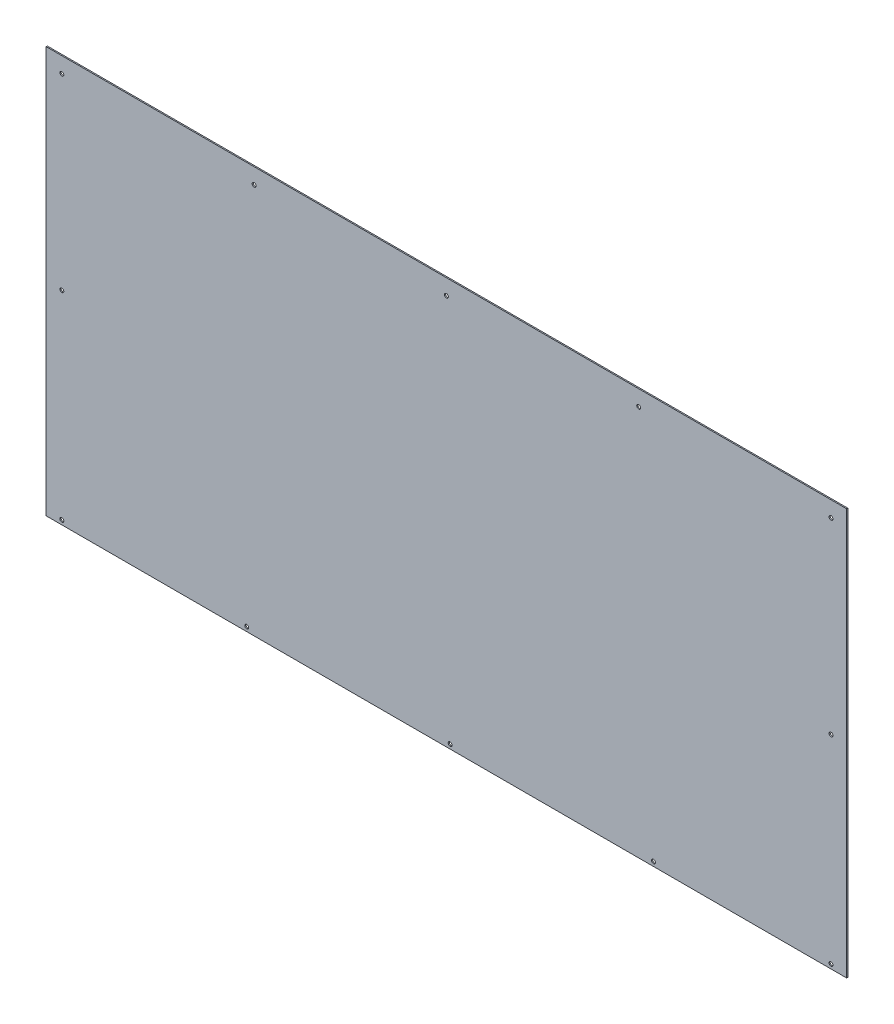
ISO-10303-21;
HEADER;
FILE_DESCRIPTION(('STEP AP214'),'2;1');
FILE_NAME('part.step','',(''),(''),'','','');
FILE_SCHEMA(('AUTOMOTIVE_DESIGN { 1 0 10303 214 1 1 1 1 }'));
ENDSEC;
DATA;
#1=APPLICATION_CONTEXT('core data for automotive mechanical design processes');
#2=APPLICATION_PROTOCOL_DEFINITION('international standard','automotive_design',2000,#1);
#3=PRODUCT_CONTEXT('',#1,'mechanical');
#4=PRODUCT('Part','Part','',(#3));
#5=PRODUCT_RELATED_PRODUCT_CATEGORY('part','',(#4));
#6=PRODUCT_DEFINITION_FORMATION('','',#4);
#7=PRODUCT_DEFINITION_CONTEXT('part definition',#1,'design');
#8=PRODUCT_DEFINITION('design','',#6,#7);
#9=PRODUCT_DEFINITION_SHAPE('','',#8);
#10=(LENGTH_UNIT() NAMED_UNIT(*) SI_UNIT(.MILLI.,.METRE.));
#11=(NAMED_UNIT(*) PLANE_ANGLE_UNIT() SI_UNIT($,.RADIAN.));
#12=(NAMED_UNIT(*) SI_UNIT($,.STERADIAN.) SOLID_ANGLE_UNIT());
#13=UNCERTAINTY_MEASURE_WITH_UNIT(LENGTH_MEASURE(1.E-05),#10,'distance_accuracy_value','');
#14=(GEOMETRIC_REPRESENTATION_CONTEXT(3) GLOBAL_UNCERTAINTY_ASSIGNED_CONTEXT((#13)) GLOBAL_UNIT_ASSIGNED_CONTEXT((#10,
#11,#12)) REPRESENTATION_CONTEXT('',''));
#15=CARTESIAN_POINT('',(0.,0.,0.));
#16=DIRECTION('',(0.,0.,1.));
#17=DIRECTION('',(1.,0.,0.));
#18=AXIS2_PLACEMENT_3D('',#15,#16,#17);
#19=CARTESIAN_POINT('',(650.,330.,1.9));
#20=DIRECTION('',(-1.,0.,0.));
#21=DIRECTION('',(0.,-1.,0.));
#22=AXIS2_PLACEMENT_3D('',#19,#20,#21);
#23=PLANE('',#22);
#24=DIRECTION('',(0.,1.,0.));
#25=VECTOR('',#24,1.);
#26=CARTESIAN_POINT('',(650.,330.,0.));
#27=LINE('',#26,#25);
#28=CARTESIAN_POINT('',(650.,-330.,0.));
#29=VERTEX_POINT('',#28);
#30=CARTESIAN_POINT('',(650.,330.,0.));
#31=VERTEX_POINT('',#30);
#32=EDGE_CURVE('E103',#29,#31,#27,.T.);
#33=ORIENTED_EDGE('',*,*,#32,.T.);
#34=DIRECTION('',(0.,0.,-1.));
#35=VECTOR('',#34,1.);
#36=CARTESIAN_POINT('',(650.,330.,1.9));
#37=LINE('',#36,#35);
#38=CARTESIAN_POINT('',(650.,330.,1.9));
#39=VERTEX_POINT('',#38);
#40=EDGE_CURVE('E11',#39,#31,#37,.T.);
#41=ORIENTED_EDGE('',*,*,#40,.F.);
#42=DIRECTION('',(0.,1.,0.));
#43=VECTOR('',#42,1.);
#44=CARTESIAN_POINT('',(650.,330.,1.9));
#45=LINE('',#44,#43);
#46=CARTESIAN_POINT('',(650.,-330.,1.9));
#47=VERTEX_POINT('',#46);
#48=EDGE_CURVE('E90',#47,#39,#45,.T.);
#49=ORIENTED_EDGE('',*,*,#48,.F.);
#50=DIRECTION('',(0.,0.,-1.));
#51=VECTOR('',#50,1.);
#52=CARTESIAN_POINT('',(650.,-330.,1.9));
#53=LINE('',#52,#51);
#54=EDGE_CURVE('E99',#47,#29,#53,.T.);
#55=ORIENTED_EDGE('',*,*,#54,.T.);
#56=EDGE_LOOP('',(#33,#41,#49,#55));
#57=FACE_BOUND('',#56,.T.);
#58=ADVANCED_FACE('F37',(#57),#23,.F.);
#59=CARTESIAN_POINT('',(-650.,330.,1.9));
#60=DIRECTION('',(0.,-1.,0.));
#61=DIRECTION('',(0.,0.,-1.));
#62=AXIS2_PLACEMENT_3D('',#59,#60,#61);
#63=PLANE('',#62);
#64=DIRECTION('',(-1.,0.,0.));
#65=VECTOR('',#64,1.);
#66=CARTESIAN_POINT('',(-650.,330.,0.));
#67=LINE('',#66,#65);
#68=CARTESIAN_POINT('',(-650.,330.,0.));
#69=VERTEX_POINT('',#68);
#70=EDGE_CURVE('E94',#31,#69,#67,.T.);
#71=ORIENTED_EDGE('',*,*,#70,.T.);
#72=DIRECTION('',(0.,0.,-1.));
#73=VECTOR('',#72,1.);
#74=CARTESIAN_POINT('',(-650.,330.,1.9));
#75=LINE('',#74,#73);
#76=CARTESIAN_POINT('',(-650.,330.,1.9));
#77=VERTEX_POINT('',#76);
#78=EDGE_CURVE('E46',#77,#69,#75,.T.);
#79=ORIENTED_EDGE('',*,*,#78,.F.);
#80=DIRECTION('',(-1.,0.,0.));
#81=VECTOR('',#80,1.);
#82=CARTESIAN_POINT('',(-650.,330.,1.9));
#83=LINE('',#82,#81);
#84=EDGE_CURVE('E85',#39,#77,#83,.T.);
#85=ORIENTED_EDGE('',*,*,#84,.F.);
#86=ORIENTED_EDGE('',*,*,#40,.T.);
#87=EDGE_LOOP('',(#71,#79,#85,#86));
#88=FACE_BOUND('',#87,.T.);
#89=ADVANCED_FACE('F93',(#88),#63,.F.);
#90=CARTESIAN_POINT('',(-650.,330.,1.9));
#91=DIRECTION('',(1.,0.,0.));
#92=DIRECTION('',(0.,1.,0.));
#93=AXIS2_PLACEMENT_3D('',#90,#91,#92);
#94=PLANE('',#93);
#95=DIRECTION('',(0.,-1.,0.));
#96=VECTOR('',#95,1.);
#97=CARTESIAN_POINT('',(-650.,330.,0.));
#98=LINE('',#97,#96);
#99=CARTESIAN_POINT('',(-650.,-330.,0.));
#100=VERTEX_POINT('',#99);
#101=EDGE_CURVE('E72',#69,#100,#98,.T.);
#102=ORIENTED_EDGE('',*,*,#101,.T.);
#103=DIRECTION('',(0.,0.,-1.));
#104=VECTOR('',#103,1.);
#105=CARTESIAN_POINT('',(-650.,-330.,1.9));
#106=LINE('',#105,#104);
#107=CARTESIAN_POINT('',(-650.,-330.,1.9));
#108=VERTEX_POINT('',#107);
#109=EDGE_CURVE('E95',#108,#100,#106,.T.);
#110=ORIENTED_EDGE('',*,*,#109,.F.);
#111=DIRECTION('',(0.,-1.,0.));
#112=VECTOR('',#111,1.);
#113=CARTESIAN_POINT('',(-650.,330.,1.9));
#114=LINE('',#113,#112);
#115=EDGE_CURVE('E88',#77,#108,#114,.T.);
#116=ORIENTED_EDGE('',*,*,#115,.F.);
#117=ORIENTED_EDGE('',*,*,#78,.T.);
#118=EDGE_LOOP('',(#102,#110,#116,#117));
#119=FACE_BOUND('',#118,.T.);
#120=ADVANCED_FACE('F97',(#119),#94,.F.);
#121=CARTESIAN_POINT('',(-650.,-330.,1.9));
#122=DIRECTION('',(0.,1.,0.));
#123=DIRECTION('',(0.,0.,1.));
#124=AXIS2_PLACEMENT_3D('',#121,#122,#123);
#125=PLANE('',#124);
#126=DIRECTION('',(1.,0.,0.));
#127=VECTOR('',#126,1.);
#128=CARTESIAN_POINT('',(-650.,-330.,0.));
#129=LINE('',#128,#127);
#130=EDGE_CURVE('E78',#100,#29,#129,.T.);
#131=ORIENTED_EDGE('',*,*,#130,.T.);
#132=ORIENTED_EDGE('',*,*,#54,.F.);
#133=DIRECTION('',(1.,0.,0.));
#134=VECTOR('',#133,1.);
#135=CARTESIAN_POINT('',(-650.,-330.,1.9));
#136=LINE('',#135,#134);
#137=EDGE_CURVE('E55',#108,#47,#136,.T.);
#138=ORIENTED_EDGE('',*,*,#137,.F.);
#139=ORIENTED_EDGE('',*,*,#109,.T.);
#140=EDGE_LOOP('',(#131,#132,#138,#139));
#141=FACE_BOUND('',#140,.T.);
#142=ADVANCED_FACE('F214',(#141),#125,.F.);
#143=CARTESIAN_POINT('',(0.,0.,1.9));
#144=DIRECTION('',(0.,0.,1.));
#145=DIRECTION('',(1.,0.,0.));
#146=AXIS2_PLACEMENT_3D('',#143,#144,#145);
#147=PLANE('',#146);
#148=CARTESIAN_POINT('',(6.00000000000012,-323.,1.9));
#149=DIRECTION('',(0.,0.,1.));
#150=DIRECTION('',(1.,0.,0.));
#151=AXIS2_PLACEMENT_3D('',#148,#149,#150);
#152=CIRCLE('',#151,3.175);
#153=CARTESIAN_POINT('',(9.17500000000012,-323.,1.9));
#154=VERTEX_POINT('',#153);
#155=EDGE_CURVE('E174',#154,#154,#152,.T.);
#156=ORIENTED_EDGE('',*,*,#155,.F.);
#157=EDGE_LOOP('',(#156));
#158=FACE_BOUND('',#157,.T.);
#159=CARTESIAN_POINT('',(336.3,-323.,1.9));
#160=DIRECTION('',(0.,0.,1.));
#161=DIRECTION('',(1.,0.,0.));
#162=AXIS2_PLACEMENT_3D('',#159,#160,#161);
#163=CIRCLE('',#162,3.17499999999997);
#164=CARTESIAN_POINT('',(339.475,-323.,1.9));
#165=VERTEX_POINT('',#164);
#166=EDGE_CURVE('E177',#165,#165,#163,.T.);
#167=ORIENTED_EDGE('',*,*,#166,.F.);
#168=EDGE_LOOP('',(#167));
#169=FACE_BOUND('',#168,.T.);
#170=CARTESIAN_POINT('',(-324.3,-323.,1.9));
#171=DIRECTION('',(0.,0.,1.));
#172=DIRECTION('',(1.,0.,0.));
#173=AXIS2_PLACEMENT_3D('',#170,#171,#172);
#174=CIRCLE('',#173,3.17499999999997);
#175=CARTESIAN_POINT('',(-321.125,-323.,1.9));
#176=VERTEX_POINT('',#175);
#177=EDGE_CURVE('E149',#176,#176,#174,.T.);
#178=ORIENTED_EDGE('',*,*,#177,.F.);
#179=EDGE_LOOP('',(#178));
#180=FACE_BOUND('',#179,.T.);
#181=CARTESIAN_POINT('',(312.3,304.6,1.9));
#182=DIRECTION('',(0.,0.,1.));
#183=DIRECTION('',(1.,0.,0.));
#184=AXIS2_PLACEMENT_3D('',#181,#182,#183);
#185=CIRCLE('',#184,3.17499999999997);
#186=CARTESIAN_POINT('',(315.475,304.6,1.9));
#187=VERTEX_POINT('',#186);
#188=EDGE_CURVE('E158',#187,#187,#185,.T.);
#189=ORIENTED_EDGE('',*,*,#188,.F.);
#190=EDGE_LOOP('',(#189));
#191=FACE_BOUND('',#190,.T.);
#192=CARTESIAN_POINT('',(-312.3,304.6,1.9));
#193=DIRECTION('',(0.,0.,1.));
#194=DIRECTION('',(1.,0.,0.));
#195=AXIS2_PLACEMENT_3D('',#192,#193,#194);
#196=CIRCLE('',#195,3.17499999999997);
#197=CARTESIAN_POINT('',(-309.125,304.6,1.9));
#198=VERTEX_POINT('',#197);
#199=EDGE_CURVE('E162',#198,#198,#196,.T.);
#200=ORIENTED_EDGE('',*,*,#199,.F.);
#201=EDGE_LOOP('',(#200));
#202=FACE_BOUND('',#201,.T.);
#203=CARTESIAN_POINT('',(0.,304.6,1.9));
#204=DIRECTION('',(0.,0.,1.));
#205=DIRECTION('',(1.,0.,0.));
#206=AXIS2_PLACEMENT_3D('',#203,#204,#205);
#207=CIRCLE('',#206,3.175);
#208=CARTESIAN_POINT('',(3.175,304.6,1.9));
#209=VERTEX_POINT('',#208);
#210=EDGE_CURVE('E159',#209,#209,#207,.T.);
#211=ORIENTED_EDGE('',*,*,#210,.F.);
#212=EDGE_LOOP('',(#211));
#213=FACE_BOUND('',#212,.T.);
#214=CARTESIAN_POINT('',(624.6,304.6,1.9));
#215=DIRECTION('',(0.,0.,1.));
#216=DIRECTION('',(-1.,0.,0.));
#217=AXIS2_PLACEMENT_3D('',#214,#215,#216);
#218=CIRCLE('',#217,3.17500000000031);
#219=CARTESIAN_POINT('',(621.425,304.6,1.9));
#220=VERTEX_POINT('',#219);
#221=EDGE_CURVE('E119',#220,#220,#218,.T.);
#222=ORIENTED_EDGE('',*,*,#221,.F.);
#223=EDGE_LOOP('',(#222));
#224=FACE_BOUND('',#223,.T.);
#225=CARTESIAN_POINT('',(-624.6,0.,1.9));
#226=DIRECTION('',(0.,0.,1.));
#227=DIRECTION('',(1.,0.,0.));
#228=AXIS2_PLACEMENT_3D('',#225,#226,#227);
#229=CIRCLE('',#228,3.17500000000008);
#230=CARTESIAN_POINT('',(-621.425,0.,1.9));
#231=VERTEX_POINT('',#230);
#232=EDGE_CURVE('E155',#231,#231,#229,.T.);
#233=ORIENTED_EDGE('',*,*,#232,.F.);
#234=EDGE_LOOP('',(#233));
#235=FACE_BOUND('',#234,.T.);
#236=CARTESIAN_POINT('',(624.6,0.,1.9));
#237=DIRECTION('',(0.,0.,1.));
#238=DIRECTION('',(-1.,0.,0.));
#239=AXIS2_PLACEMENT_3D('',#236,#237,#238);
#240=CIRCLE('',#239,3.17500000000008);
#241=CARTESIAN_POINT('',(621.425,0.,1.9));
#242=VERTEX_POINT('',#241);
#243=EDGE_CURVE('E152',#242,#242,#240,.T.);
#244=ORIENTED_EDGE('',*,*,#243,.F.);
#245=EDGE_LOOP('',(#244));
#246=FACE_BOUND('',#245,.T.);
#247=CARTESIAN_POINT('',(-624.6,-323.,1.9));
#248=DIRECTION('',(0.,0.,1.));
#249=DIRECTION('',(1.,0.,0.));
#250=AXIS2_PLACEMENT_3D('',#247,#248,#249);
#251=CIRCLE('',#250,3.17500000000008);
#252=CARTESIAN_POINT('',(-621.425,-323.,1.9));
#253=VERTEX_POINT('',#252);
#254=EDGE_CURVE('E148',#253,#253,#251,.T.);
#255=ORIENTED_EDGE('',*,*,#254,.F.);
#256=EDGE_LOOP('',(#255));
#257=FACE_BOUND('',#256,.T.);
#258=CARTESIAN_POINT('',(624.6,-323.,1.9));
#259=DIRECTION('',(0.,0.,1.));
#260=DIRECTION('',(-1.,0.,0.));
#261=AXIS2_PLACEMENT_3D('',#258,#259,#260);
#262=CIRCLE('',#261,3.17500000000008);
#263=CARTESIAN_POINT('',(621.425,-323.,1.9));
#264=VERTEX_POINT('',#263);
#265=EDGE_CURVE('E145',#264,#264,#262,.T.);
#266=ORIENTED_EDGE('',*,*,#265,.F.);
#267=EDGE_LOOP('',(#266));
#268=FACE_BOUND('',#267,.T.);
#269=CARTESIAN_POINT('',(-624.6,304.6,1.9));
#270=DIRECTION('',(0.,0.,1.));
#271=DIRECTION('',(1.,0.,0.));
#272=AXIS2_PLACEMENT_3D('',#269,#270,#271);
#273=CIRCLE('',#272,3.17500000000008);
#274=CARTESIAN_POINT('',(-621.425,304.6,1.9));
#275=VERTEX_POINT('',#274);
#276=EDGE_CURVE('E114',#275,#275,#273,.T.);
#277=ORIENTED_EDGE('',*,*,#276,.F.);
#278=EDGE_LOOP('',(#277));
#279=FACE_BOUND('',#278,.T.);
#280=ORIENTED_EDGE('',*,*,#48,.T.);
#281=ORIENTED_EDGE('',*,*,#84,.T.);
#282=ORIENTED_EDGE('',*,*,#115,.T.);
#283=ORIENTED_EDGE('',*,*,#137,.T.);
#284=EDGE_LOOP('',(#280,#281,#282,#283));
#285=FACE_BOUND('',#284,.T.);
#286=ADVANCED_FACE('F86',(#158,#169,#180,#191,#202,#213,#224,#235,#246,#257,#268,#279,#285),
#147,.T.);
#287=CARTESIAN_POINT('',(0.,0.,0.));
#288=DIRECTION('',(0.,0.,1.));
#289=DIRECTION('',(1.,0.,0.));
#290=AXIS2_PLACEMENT_3D('',#287,#288,#289);
#291=PLANE('',#290);
#292=CARTESIAN_POINT('',(6.00000000000012,-323.,0.));
#293=DIRECTION('',(0.,0.,-1.));
#294=DIRECTION('',(-1.,0.,0.));
#295=AXIS2_PLACEMENT_3D('',#292,#293,#294);
#296=CIRCLE('',#295,3.175);
#297=CARTESIAN_POINT('',(2.82500000000012,-323.,0.));
#298=VERTEX_POINT('',#297);
#299=EDGE_CURVE('E180',#298,#298,#296,.T.);
#300=ORIENTED_EDGE('',*,*,#299,.F.);
#301=EDGE_LOOP('',(#300));
#302=FACE_BOUND('',#301,.T.);
#303=CARTESIAN_POINT('',(336.3,-323.,0.));
#304=DIRECTION('',(0.,0.,-1.));
#305=DIRECTION('',(-1.,0.,0.));
#306=AXIS2_PLACEMENT_3D('',#303,#304,#305);
#307=CIRCLE('',#306,3.17499999999997);
#308=CARTESIAN_POINT('',(333.125,-323.,0.));
#309=VERTEX_POINT('',#308);
#310=EDGE_CURVE('E181',#309,#309,#307,.T.);
#311=ORIENTED_EDGE('',*,*,#310,.F.);
#312=EDGE_LOOP('',(#311));
#313=FACE_BOUND('',#312,.T.);
#314=CARTESIAN_POINT('',(-324.3,-323.,0.));
#315=DIRECTION('',(0.,0.,-1.));
#316=DIRECTION('',(-1.,0.,0.));
#317=AXIS2_PLACEMENT_3D('',#314,#315,#316);
#318=CIRCLE('',#317,3.17499999999997);
#319=CARTESIAN_POINT('',(-327.475,-323.,0.));
#320=VERTEX_POINT('',#319);
#321=EDGE_CURVE('E171',#320,#320,#318,.T.);
#322=ORIENTED_EDGE('',*,*,#321,.F.);
#323=EDGE_LOOP('',(#322));
#324=FACE_BOUND('',#323,.T.);
#325=CARTESIAN_POINT('',(312.3,304.6,0.));
#326=DIRECTION('',(0.,0.,1.));
#327=DIRECTION('',(1.,0.,0.));
#328=AXIS2_PLACEMENT_3D('',#325,#326,#327);
#329=CIRCLE('',#328,3.17499999999997);
#330=CARTESIAN_POINT('',(315.475,304.6,0.));
#331=VERTEX_POINT('',#330);
#332=EDGE_CURVE('E40',#331,#331,#329,.T.);
#333=ORIENTED_EDGE('',*,*,#332,.T.);
#334=EDGE_LOOP('',(#333));
#335=FACE_BOUND('',#334,.T.);
#336=CARTESIAN_POINT('',(-312.3,304.6,0.));
#337=DIRECTION('',(0.,0.,1.));
#338=DIRECTION('',(1.,0.,0.));
#339=AXIS2_PLACEMENT_3D('',#336,#337,#338);
#340=CIRCLE('',#339,3.17499999999997);
#341=CARTESIAN_POINT('',(-309.125,304.6,0.));
#342=VERTEX_POINT('',#341);
#343=EDGE_CURVE('E133',#342,#342,#340,.T.);
#344=ORIENTED_EDGE('',*,*,#343,.T.);
#345=EDGE_LOOP('',(#344));
#346=FACE_BOUND('',#345,.T.);
#347=CARTESIAN_POINT('',(0.,304.6,0.));
#348=DIRECTION('',(0.,0.,1.));
#349=DIRECTION('',(1.,0.,0.));
#350=AXIS2_PLACEMENT_3D('',#347,#348,#349);
#351=CIRCLE('',#350,3.175);
#352=CARTESIAN_POINT('',(3.175,304.6,0.));
#353=VERTEX_POINT('',#352);
#354=EDGE_CURVE('E131',#353,#353,#351,.T.);
#355=ORIENTED_EDGE('',*,*,#354,.T.);
#356=EDGE_LOOP('',(#355));
#357=FACE_BOUND('',#356,.T.);
#358=CARTESIAN_POINT('',(624.6,304.6,0.));
#359=DIRECTION('',(0.,0.,1.));
#360=DIRECTION('',(1.,0.,0.));
#361=AXIS2_PLACEMENT_3D('',#358,#359,#360);
#362=CIRCLE('',#361,3.17500000000031);
#363=CARTESIAN_POINT('',(627.775,304.6,0.));
#364=VERTEX_POINT('',#363);
#365=EDGE_CURVE('E128',#364,#364,#362,.T.);
#366=ORIENTED_EDGE('',*,*,#365,.T.);
#367=EDGE_LOOP('',(#366));
#368=FACE_BOUND('',#367,.T.);
#369=CARTESIAN_POINT('',(-624.6,0.,0.));
#370=DIRECTION('',(0.,0.,1.));
#371=DIRECTION('',(1.,0.,0.));
#372=AXIS2_PLACEMENT_3D('',#369,#370,#371);
#373=CIRCLE('',#372,3.17500000000008);
#374=CARTESIAN_POINT('',(-621.425,0.,0.));
#375=VERTEX_POINT('',#374);
#376=EDGE_CURVE('E125',#375,#375,#373,.T.);
#377=ORIENTED_EDGE('',*,*,#376,.T.);
#378=EDGE_LOOP('',(#377));
#379=FACE_BOUND('',#378,.T.);
#380=CARTESIAN_POINT('',(624.6,0.,0.));
#381=DIRECTION('',(0.,0.,1.));
#382=DIRECTION('',(1.,0.,0.));
#383=AXIS2_PLACEMENT_3D('',#380,#381,#382);
#384=CIRCLE('',#383,3.17500000000008);
#385=CARTESIAN_POINT('',(627.775,0.,0.));
#386=VERTEX_POINT('',#385);
#387=EDGE_CURVE('E122',#386,#386,#384,.T.);
#388=ORIENTED_EDGE('',*,*,#387,.T.);
#389=EDGE_LOOP('',(#388));
#390=FACE_BOUND('',#389,.T.);
#391=CARTESIAN_POINT('',(-624.6,-323.,0.));
#392=DIRECTION('',(0.,0.,1.));
#393=DIRECTION('',(1.,0.,0.));
#394=AXIS2_PLACEMENT_3D('',#391,#392,#393);
#395=CIRCLE('',#394,3.17500000000008);
#396=CARTESIAN_POINT('',(-621.425,-323.,0.));
#397=VERTEX_POINT('',#396);
#398=EDGE_CURVE('E118',#397,#397,#395,.T.);
#399=ORIENTED_EDGE('',*,*,#398,.T.);
#400=EDGE_LOOP('',(#399));
#401=FACE_BOUND('',#400,.T.);
#402=CARTESIAN_POINT('',(624.6,-323.,0.));
#403=DIRECTION('',(0.,0.,1.));
#404=DIRECTION('',(1.,0.,0.));
#405=AXIS2_PLACEMENT_3D('',#402,#403,#404);
#406=CIRCLE('',#405,3.17500000000008);
#407=CARTESIAN_POINT('',(627.775,-323.,0.));
#408=VERTEX_POINT('',#407);
#409=EDGE_CURVE('E115',#408,#408,#406,.T.);
#410=ORIENTED_EDGE('',*,*,#409,.T.);
#411=EDGE_LOOP('',(#410));
#412=FACE_BOUND('',#411,.T.);
#413=CARTESIAN_POINT('',(-624.6,304.6,0.));
#414=DIRECTION('',(0.,0.,1.));
#415=DIRECTION('',(1.,0.,0.));
#416=AXIS2_PLACEMENT_3D('',#413,#414,#415);
#417=CIRCLE('',#416,3.17500000000008);
#418=CARTESIAN_POINT('',(-621.425,304.6,0.));
#419=VERTEX_POINT('',#418);
#420=EDGE_CURVE('E106',#419,#419,#417,.T.);
#421=ORIENTED_EDGE('',*,*,#420,.T.);
#422=EDGE_LOOP('',(#421));
#423=FACE_BOUND('',#422,.T.);
#424=ORIENTED_EDGE('',*,*,#32,.F.);
#425=ORIENTED_EDGE('',*,*,#130,.F.);
#426=ORIENTED_EDGE('',*,*,#101,.F.);
#427=ORIENTED_EDGE('',*,*,#70,.F.);
#428=EDGE_LOOP('',(#424,#425,#426,#427));
#429=FACE_BOUND('',#428,.T.);
#430=ADVANCED_FACE('F189',(#302,#313,#324,#335,#346,#357,#368,#379,#390,#401,#412,#423,#429),
#291,.F.);
#431=CARTESIAN_POINT('',(-624.6,304.6,-4.45));
#432=DIRECTION('',(0.,0.,1.));
#433=DIRECTION('',(1.,0.,0.));
#434=AXIS2_PLACEMENT_3D('',#431,#432,#433);
#435=CYLINDRICAL_SURFACE('',#434,3.17500000000008);
#436=ORIENTED_EDGE('',*,*,#276,.T.);
#437=EDGE_LOOP('',(#436));
#438=FACE_BOUND('',#437,.T.);
#439=ORIENTED_EDGE('',*,*,#420,.F.);
#440=EDGE_LOOP('',(#439));
#441=FACE_BOUND('',#440,.T.);
#442=ADVANCED_FACE('F192',(#438,#441),#435,.F.);
#443=CARTESIAN_POINT('',(624.6,-323.,-4.45));
#444=DIRECTION('',(0.,0.,1.));
#445=DIRECTION('',(1.,0.,0.));
#446=AXIS2_PLACEMENT_3D('',#443,#444,#445);
#447=CYLINDRICAL_SURFACE('',#446,3.17500000000008);
#448=ORIENTED_EDGE('',*,*,#265,.T.);
#449=EDGE_LOOP('',(#448));
#450=FACE_BOUND('',#449,.T.);
#451=ORIENTED_EDGE('',*,*,#409,.F.);
#452=EDGE_LOOP('',(#451));
#453=FACE_BOUND('',#452,.T.);
#454=ADVANCED_FACE('F248',(#450,#453),#447,.F.);
#455=CARTESIAN_POINT('',(-624.6,-323.,-4.45));
#456=DIRECTION('',(0.,0.,1.));
#457=DIRECTION('',(1.,0.,0.));
#458=AXIS2_PLACEMENT_3D('',#455,#456,#457);
#459=CYLINDRICAL_SURFACE('',#458,3.17500000000008);
#460=ORIENTED_EDGE('',*,*,#254,.T.);
#461=EDGE_LOOP('',(#460));
#462=FACE_BOUND('',#461,.T.);
#463=ORIENTED_EDGE('',*,*,#398,.F.);
#464=EDGE_LOOP('',(#463));
#465=FACE_BOUND('',#464,.T.);
#466=ADVANCED_FACE('F258',(#462,#465),#459,.F.);
#467=CARTESIAN_POINT('',(624.6,0.,-4.45));
#468=DIRECTION('',(0.,0.,1.));
#469=DIRECTION('',(1.,0.,0.));
#470=AXIS2_PLACEMENT_3D('',#467,#468,#469);
#471=CYLINDRICAL_SURFACE('',#470,3.17500000000008);
#472=ORIENTED_EDGE('',*,*,#243,.T.);
#473=EDGE_LOOP('',(#472));
#474=FACE_BOUND('',#473,.T.);
#475=ORIENTED_EDGE('',*,*,#387,.F.);
#476=EDGE_LOOP('',(#475));
#477=FACE_BOUND('',#476,.T.);
#478=ADVANCED_FACE('F268',(#474,#477),#471,.F.);
#479=CARTESIAN_POINT('',(-624.6,0.,-4.45));
#480=DIRECTION('',(0.,0.,1.));
#481=DIRECTION('',(1.,0.,0.));
#482=AXIS2_PLACEMENT_3D('',#479,#480,#481);
#483=CYLINDRICAL_SURFACE('',#482,3.17500000000008);
#484=ORIENTED_EDGE('',*,*,#232,.T.);
#485=EDGE_LOOP('',(#484));
#486=FACE_BOUND('',#485,.T.);
#487=ORIENTED_EDGE('',*,*,#376,.F.);
#488=EDGE_LOOP('',(#487));
#489=FACE_BOUND('',#488,.T.);
#490=ADVANCED_FACE('F278',(#486,#489),#483,.F.);
#491=CARTESIAN_POINT('',(624.6,304.6,-4.45));
#492=DIRECTION('',(0.,0.,1.));
#493=DIRECTION('',(1.,0.,0.));
#494=AXIS2_PLACEMENT_3D('',#491,#492,#493);
#495=CYLINDRICAL_SURFACE('',#494,3.17500000000031);
#496=ORIENTED_EDGE('',*,*,#221,.T.);
#497=EDGE_LOOP('',(#496));
#498=FACE_BOUND('',#497,.T.);
#499=ORIENTED_EDGE('',*,*,#365,.F.);
#500=EDGE_LOOP('',(#499));
#501=FACE_BOUND('',#500,.T.);
#502=ADVANCED_FACE('F288',(#498,#501),#495,.F.);
#503=CARTESIAN_POINT('',(0.,304.6,-4.45));
#504=DIRECTION('',(0.,0.,1.));
#505=DIRECTION('',(1.,0.,0.));
#506=AXIS2_PLACEMENT_3D('',#503,#504,#505);
#507=CYLINDRICAL_SURFACE('',#506,3.175);
#508=ORIENTED_EDGE('',*,*,#210,.T.);
#509=EDGE_LOOP('',(#508));
#510=FACE_BOUND('',#509,.T.);
#511=ORIENTED_EDGE('',*,*,#354,.F.);
#512=EDGE_LOOP('',(#511));
#513=FACE_BOUND('',#512,.T.);
#514=ADVANCED_FACE('F298',(#510,#513),#507,.F.);
#515=CARTESIAN_POINT('',(-312.3,304.6,-4.45));
#516=DIRECTION('',(0.,0.,1.));
#517=DIRECTION('',(1.,0.,0.));
#518=AXIS2_PLACEMENT_3D('',#515,#516,#517);
#519=CYLINDRICAL_SURFACE('',#518,3.17499999999997);
#520=ORIENTED_EDGE('',*,*,#199,.T.);
#521=EDGE_LOOP('',(#520));
#522=FACE_BOUND('',#521,.T.);
#523=ORIENTED_EDGE('',*,*,#343,.F.);
#524=EDGE_LOOP('',(#523));
#525=FACE_BOUND('',#524,.T.);
#526=ADVANCED_FACE('F308',(#522,#525),#519,.F.);
#527=CARTESIAN_POINT('',(312.3,304.6,-4.45));
#528=DIRECTION('',(0.,0.,1.));
#529=DIRECTION('',(1.,0.,0.));
#530=AXIS2_PLACEMENT_3D('',#527,#528,#529);
#531=CYLINDRICAL_SURFACE('',#530,3.17499999999997);
#532=ORIENTED_EDGE('',*,*,#188,.T.);
#533=EDGE_LOOP('',(#532));
#534=FACE_BOUND('',#533,.T.);
#535=ORIENTED_EDGE('',*,*,#332,.F.);
#536=EDGE_LOOP('',(#535));
#537=FACE_BOUND('',#536,.T.);
#538=ADVANCED_FACE('F318',(#534,#537),#531,.F.);
#539=CARTESIAN_POINT('',(-324.3,-323.,10.));
#540=DIRECTION('',(0.,0.,-1.));
#541=DIRECTION('',(-1.,0.,0.));
#542=AXIS2_PLACEMENT_3D('',#539,#540,#541);
#543=CYLINDRICAL_SURFACE('',#542,3.17499999999997);
#544=ORIENTED_EDGE('',*,*,#177,.T.);
#545=EDGE_LOOP('',(#544));
#546=FACE_BOUND('',#545,.T.);
#547=ORIENTED_EDGE('',*,*,#321,.T.);
#548=EDGE_LOOP('',(#547));
#549=FACE_BOUND('',#548,.T.);
#550=ADVANCED_FACE('F328',(#546,#549),#543,.F.);
#551=CARTESIAN_POINT('',(336.3,-323.,10.));
#552=DIRECTION('',(0.,0.,-1.));
#553=DIRECTION('',(-1.,0.,0.));
#554=AXIS2_PLACEMENT_3D('',#551,#552,#553);
#555=CYLINDRICAL_SURFACE('',#554,3.17499999999997);
#556=ORIENTED_EDGE('',*,*,#166,.T.);
#557=EDGE_LOOP('',(#556));
#558=FACE_BOUND('',#557,.T.);
#559=ORIENTED_EDGE('',*,*,#310,.T.);
#560=EDGE_LOOP('',(#559));
#561=FACE_BOUND('',#560,.T.);
#562=ADVANCED_FACE('F348',(#558,#561),#555,.F.);
#563=CARTESIAN_POINT('',(6.00000000000012,-323.,10.));
#564=DIRECTION('',(0.,0.,-1.));
#565=DIRECTION('',(-1.,0.,0.));
#566=AXIS2_PLACEMENT_3D('',#563,#564,#565);
#567=CYLINDRICAL_SURFACE('',#566,3.175);
#568=ORIENTED_EDGE('',*,*,#155,.T.);
#569=EDGE_LOOP('',(#568));
#570=FACE_BOUND('',#569,.T.);
#571=ORIENTED_EDGE('',*,*,#299,.T.);
#572=EDGE_LOOP('',(#571));
#573=FACE_BOUND('',#572,.T.);
#574=ADVANCED_FACE('F187',(#570,#573),#567,.F.);
#575=CLOSED_SHELL('',(#58,#89,#120,#142,#286,#430,#442,#454,#466,#478,#490,#502,#514,#526,#538,
#550,#562,#574));
#576=MANIFOLD_SOLID_BREP('B2',#575);
#577=ADVANCED_BREP_SHAPE_REPRESENTATION('',(#18,#576),#14);
#578=SHAPE_DEFINITION_REPRESENTATION(#9,#577);
ENDSEC;
END-ISO-10303-21;
